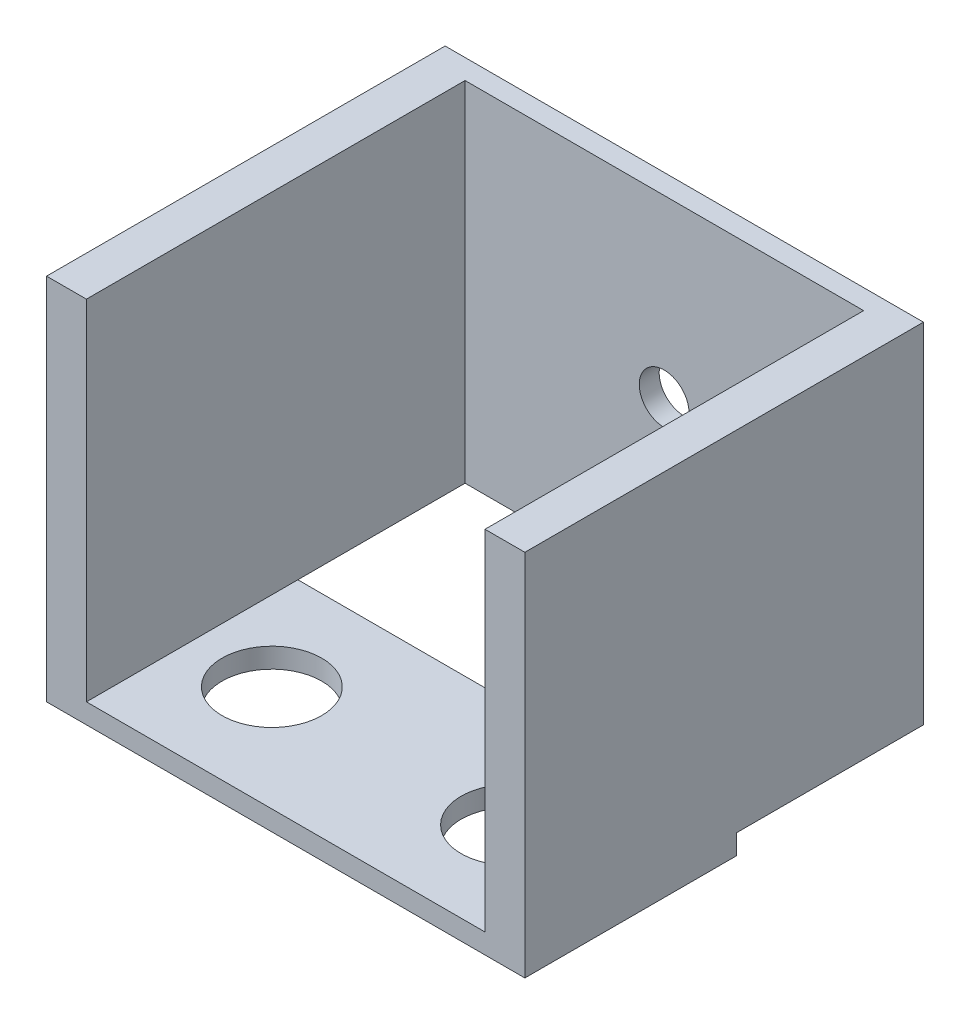
ISO-10303-21;
HEADER;
FILE_DESCRIPTION(('STEP AP214'),'2;1');
FILE_NAME('part.step','',(''),(''),'','','');
FILE_SCHEMA(('AUTOMOTIVE_DESIGN { 1 0 10303 214 1 1 1 1 }'));
ENDSEC;
DATA;
#1=APPLICATION_CONTEXT('core data for automotive mechanical design processes');
#2=APPLICATION_PROTOCOL_DEFINITION('international standard','automotive_design',2000,#1);
#3=PRODUCT_CONTEXT('',#1,'mechanical');
#4=PRODUCT('Part','Part','',(#3));
#5=PRODUCT_RELATED_PRODUCT_CATEGORY('part','',(#4));
#6=PRODUCT_DEFINITION_FORMATION('','',#4);
#7=PRODUCT_DEFINITION_CONTEXT('part definition',#1,'design');
#8=PRODUCT_DEFINITION('design','',#6,#7);
#9=PRODUCT_DEFINITION_SHAPE('','',#8);
#10=(LENGTH_UNIT() NAMED_UNIT(*) SI_UNIT(.MILLI.,.METRE.));
#11=(NAMED_UNIT(*) PLANE_ANGLE_UNIT() SI_UNIT($,.RADIAN.));
#12=(NAMED_UNIT(*) SI_UNIT($,.STERADIAN.) SOLID_ANGLE_UNIT());
#13=UNCERTAINTY_MEASURE_WITH_UNIT(LENGTH_MEASURE(1.E-05),#10,'distance_accuracy_value','');
#14=(GEOMETRIC_REPRESENTATION_CONTEXT(3) GLOBAL_UNCERTAINTY_ASSIGNED_CONTEXT((#13)) GLOBAL_UNIT_ASSIGNED_CONTEXT((#10,
#11,#12)) REPRESENTATION_CONTEXT('',''));
#15=CARTESIAN_POINT('',(0.,0.,0.));
#16=DIRECTION('',(0.,0.,1.));
#17=DIRECTION('',(1.,0.,0.));
#18=AXIS2_PLACEMENT_3D('',#15,#16,#17);
#19=CARTESIAN_POINT('',(-51.7921740237691,-38.6713921901528,2.));
#20=DIRECTION('',(0.,1.,0.));
#21=DIRECTION('',(0.,0.,1.));
#22=AXIS2_PLACEMENT_3D('',#19,#20,#21);
#23=PLANE('',#22);
#24=DIRECTION('',(1.,0.,0.));
#25=VECTOR('',#24,1.);
#26=CARTESIAN_POINT('',(-51.7921740237691,-38.6713921901528,18.7799117510892));
#27=LINE('',#26,#25);
#28=CARTESIAN_POINT('',(-51.7921740237691,-38.6713921901528,18.7799117510892));
#29=VERTEX_POINT('',#28);
#30=CARTESIAN_POINT('',(-47.7921740237691,-38.6713921901528,18.7799117510892));
#31=VERTEX_POINT('',#30);
#32=EDGE_CURVE('E50',#29,#31,#27,.T.);
#33=ORIENTED_EDGE('',*,*,#32,.F.);
#34=DIRECTION('',(0.,0.,-1.));
#35=VECTOR('',#34,1.);
#36=CARTESIAN_POINT('',(-51.7921740237691,-38.6713921901528,2.));
#37=LINE('',#36,#35);
#38=CARTESIAN_POINT('',(-51.7921740237691,-38.6713921901528,0.));
#39=VERTEX_POINT('',#38);
#40=EDGE_CURVE('E42',#29,#39,#37,.T.);
#41=ORIENTED_EDGE('',*,*,#40,.T.);
#42=DIRECTION('',(1.,0.,0.));
#43=VECTOR('',#42,1.);
#44=CARTESIAN_POINT('',(-51.7921740237691,-38.6713921901528,0.));
#45=LINE('',#44,#43);
#46=CARTESIAN_POINT('',(-3.79217402376909,-38.6713921901528,0.));
#47=VERTEX_POINT('',#46);
#48=EDGE_CURVE('E208',#39,#47,#45,.T.);
#49=ORIENTED_EDGE('',*,*,#48,.T.);
#50=DIRECTION('',(0.,0.,-1.));
#51=VECTOR('',#50,1.);
#52=CARTESIAN_POINT('',(-3.79217402376909,-38.6713921901528,2.));
#53=LINE('',#52,#51);
#54=CARTESIAN_POINT('',(-3.7921740237691,-38.6713921901528,18.7799117510892));
#55=VERTEX_POINT('',#54);
#56=EDGE_CURVE('E193',#55,#47,#53,.T.);
#57=ORIENTED_EDGE('',*,*,#56,.F.);
#58=CARTESIAN_POINT('',(-7.79217402376909,-38.6713921901528,18.7799117510892));
#59=VERTEX_POINT('',#58);
#60=EDGE_CURVE('E11',#59,#55,#27,.T.);
#61=ORIENTED_EDGE('',*,*,#60,.F.);
#62=DIRECTION('',(0.,0.,-1.));
#63=VECTOR('',#62,1.);
#64=CARTESIAN_POINT('',(-7.79217402376909,-38.6713921901528,40.));
#65=LINE('',#64,#63);
#66=CARTESIAN_POINT('',(-7.79217402376909,-38.6713921901528,2.));
#67=VERTEX_POINT('',#66);
#68=EDGE_CURVE('E236',#59,#67,#65,.T.);
#69=ORIENTED_EDGE('',*,*,#68,.T.);
#70=DIRECTION('',(1.,0.,0.));
#71=VECTOR('',#70,1.);
#72=CARTESIAN_POINT('',(-51.7921740237691,-38.6713921901528,2.));
#73=LINE('',#72,#71);
#74=CARTESIAN_POINT('',(-47.7921740237691,-38.6713921901528,2.));
#75=VERTEX_POINT('',#74);
#76=EDGE_CURVE('E174',#75,#67,#73,.T.);
#77=ORIENTED_EDGE('',*,*,#76,.F.);
#78=DIRECTION('',(0.,0.,-1.));
#79=VECTOR('',#78,1.);
#80=CARTESIAN_POINT('',(-47.7921740237691,-38.6713921901528,40.));
#81=LINE('',#80,#79);
#82=EDGE_CURVE('E179',#31,#75,#81,.T.);
#83=ORIENTED_EDGE('',*,*,#82,.F.);
#84=EDGE_LOOP('',(#33,#41,#49,#57,#61,#69,#77,#83));
#85=FACE_BOUND('',#84,.T.);
#86=ADVANCED_FACE('F33',(#85),#23,.F.);
#87=CARTESIAN_POINT('',(0.,0.,2.));
#88=DIRECTION('',(0.,0.,1.));
#89=DIRECTION('',(1.,0.,0.));
#90=AXIS2_PLACEMENT_3D('',#87,#88,#89);
#91=PLANE('',#90);
#92=CARTESIAN_POINT('',(-27.8109499656491,-21.3376292562887,2.));
#93=DIRECTION('',(0.,0.,1.));
#94=DIRECTION('',(1.,0.,0.));
#95=AXIS2_PLACEMENT_3D('',#92,#93,#94);
#96=CIRCLE('',#95,2.5);
#97=CARTESIAN_POINT('',(-25.3109499656491,-21.3376292562887,2.));
#98=VERTEX_POINT('',#97);
#99=EDGE_CURVE('E170',#98,#98,#96,.T.);
#100=ORIENTED_EDGE('',*,*,#99,.F.);
#101=EDGE_LOOP('',(#100));
#102=FACE_BOUND('',#101,.T.);
#103=ORIENTED_EDGE('',*,*,#76,.T.);
#104=DIRECTION('',(0.,-1.,0.));
#105=VECTOR('',#104,1.);
#106=CARTESIAN_POINT('',(-7.79217402376909,-3.67139219015279,2.));
#107=LINE('',#106,#105);
#108=CARTESIAN_POINT('',(-7.79217402376909,-3.67139219015279,2.));
#109=VERTEX_POINT('',#108);
#110=EDGE_CURVE('E140',#109,#67,#107,.T.);
#111=ORIENTED_EDGE('',*,*,#110,.F.);
#112=DIRECTION('',(-1.,0.,0.));
#113=VECTOR('',#112,1.);
#114=CARTESIAN_POINT('',(-51.7921740237691,-3.67139219015279,2.));
#115=LINE('',#114,#113);
#116=CARTESIAN_POINT('',(-47.7921740237691,-3.67139219015279,2.));
#117=VERTEX_POINT('',#116);
#118=EDGE_CURVE('E187',#109,#117,#115,.T.);
#119=ORIENTED_EDGE('',*,*,#118,.T.);
#120=DIRECTION('',(0.,1.,0.));
#121=VECTOR('',#120,1.);
#122=CARTESIAN_POINT('',(-47.7921740237691,-3.67139219015279,2.));
#123=LINE('',#122,#121);
#124=EDGE_CURVE('E160',#75,#117,#123,.T.);
#125=ORIENTED_EDGE('',*,*,#124,.F.);
#126=EDGE_LOOP('',(#103,#111,#119,#125));
#127=FACE_BOUND('',#126,.T.);
#128=ADVANCED_FACE('F223',(#102,#127),#91,.T.);
#129=CARTESIAN_POINT('',(0.,0.,0.));
#130=DIRECTION('',(0.,0.,1.));
#131=DIRECTION('',(1.,0.,0.));
#132=AXIS2_PLACEMENT_3D('',#129,#130,#131);
#133=PLANE('',#132);
#134=DIRECTION('',(0.,-1.,0.));
#135=VECTOR('',#134,1.);
#136=CARTESIAN_POINT('',(-51.7921740237691,-3.67139219015279,0.));
#137=LINE('',#136,#135);
#138=CARTESIAN_POINT('',(-51.7921740237691,-3.67139219015279,0.));
#139=VERTEX_POINT('',#138);
#140=EDGE_CURVE('E211',#139,#39,#137,.T.);
#141=ORIENTED_EDGE('',*,*,#140,.F.);
#142=DIRECTION('',(-1.,0.,0.));
#143=VECTOR('',#142,1.);
#144=CARTESIAN_POINT('',(-51.7921740237691,-3.67139219015279,0.));
#145=LINE('',#144,#143);
#146=CARTESIAN_POINT('',(-3.7921740237691,-3.67139219015279,0.));
#147=VERTEX_POINT('',#146);
#148=EDGE_CURVE('E204',#147,#139,#145,.T.);
#149=ORIENTED_EDGE('',*,*,#148,.F.);
#150=DIRECTION('',(0.,1.,0.));
#151=VECTOR('',#150,1.);
#152=CARTESIAN_POINT('',(-3.7921740237691,-3.67139219015279,0.));
#153=LINE('',#152,#151);
#154=EDGE_CURVE('E206',#47,#147,#153,.T.);
#155=ORIENTED_EDGE('',*,*,#154,.F.);
#156=ORIENTED_EDGE('',*,*,#48,.F.);
#157=EDGE_LOOP('',(#141,#149,#155,#156));
#158=FACE_BOUND('',#157,.T.);
#159=CARTESIAN_POINT('',(-27.8109499656491,-21.3376292562887,0.));
#160=DIRECTION('',(0.,0.,1.));
#161=DIRECTION('',(1.,0.,0.));
#162=AXIS2_PLACEMENT_3D('',#159,#160,#161);
#163=CIRCLE('',#162,2.5);
#164=CARTESIAN_POINT('',(-25.3109499656491,-21.3376292562887,0.));
#165=VERTEX_POINT('',#164);
#166=EDGE_CURVE('E184',#165,#165,#163,.T.);
#167=ORIENTED_EDGE('',*,*,#166,.T.);
#168=EDGE_LOOP('',(#167));
#169=FACE_BOUND('',#168,.T.);
#170=ADVANCED_FACE('F226',(#158,#169),#133,.F.);
#171=CARTESIAN_POINT('',(-51.7921740237691,-3.67139219015279,2.));
#172=DIRECTION('',(1.,0.,0.));
#173=DIRECTION('',(0.,0.,-1.));
#174=AXIS2_PLACEMENT_3D('',#171,#172,#173);
#175=PLANE('',#174);
#176=ORIENTED_EDGE('',*,*,#140,.T.);
#177=ORIENTED_EDGE('',*,*,#40,.F.);
#178=DIRECTION('',(0.,1.,0.));
#179=VECTOR('',#178,1.);
#180=CARTESIAN_POINT('',(-51.7921740237691,-40.6713921901528,18.7799117510892));
#181=LINE('',#180,#179);
#182=CARTESIAN_POINT('',(-51.7921740237691,-40.6713921901528,18.7799117510892));
#183=VERTEX_POINT('',#182);
#184=EDGE_CURVE('E120',#183,#29,#181,.T.);
#185=ORIENTED_EDGE('',*,*,#184,.F.);
#186=DIRECTION('',(0.,0.,-1.));
#187=VECTOR('',#186,1.);
#188=CARTESIAN_POINT('',(-51.7921740237691,-40.6713921901528,40.));
#189=LINE('',#188,#187);
#190=CARTESIAN_POINT('',(-51.7921740237691,-40.6713921901528,40.));
#191=VERTEX_POINT('',#190);
#192=EDGE_CURVE('E127',#191,#183,#189,.T.);
#193=ORIENTED_EDGE('',*,*,#192,.F.);
#194=DIRECTION('',(0.,-1.,0.));
#195=VECTOR('',#194,1.);
#196=CARTESIAN_POINT('',(-51.7921740237691,-3.67139219015279,40.));
#197=LINE('',#196,#195);
#198=CARTESIAN_POINT('',(-51.7921740237691,-3.67139219015279,40.));
#199=VERTEX_POINT('',#198);
#200=EDGE_CURVE('E153',#199,#191,#197,.T.);
#201=ORIENTED_EDGE('',*,*,#200,.F.);
#202=DIRECTION('',(0.,0.,-1.));
#203=VECTOR('',#202,1.);
#204=CARTESIAN_POINT('',(-51.7921740237691,-3.67139219015279,2.));
#205=LINE('',#204,#203);
#206=EDGE_CURVE('E201',#199,#139,#205,.T.);
#207=ORIENTED_EDGE('',*,*,#206,.T.);
#208=EDGE_LOOP('',(#176,#177,#185,#193,#201,#207));
#209=FACE_BOUND('',#208,.T.);
#210=ADVANCED_FACE('F35',(#209),#175,.F.);
#211=CARTESIAN_POINT('',(-3.7921740237691,-3.67139219015279,2.));
#212=DIRECTION('',(-1.,0.,0.));
#213=DIRECTION('',(0.,-1.,0.));
#214=AXIS2_PLACEMENT_3D('',#211,#212,#213);
#215=PLANE('',#214);
#216=ORIENTED_EDGE('',*,*,#154,.T.);
#217=DIRECTION('',(0.,0.,-1.));
#218=VECTOR('',#217,1.);
#219=CARTESIAN_POINT('',(-3.7921740237691,-3.67139219015279,2.));
#220=LINE('',#219,#218);
#221=CARTESIAN_POINT('',(-3.7921740237691,-3.67139219015279,40.));
#222=VERTEX_POINT('',#221);
#223=EDGE_CURVE('E198',#222,#147,#220,.T.);
#224=ORIENTED_EDGE('',*,*,#223,.F.);
#225=DIRECTION('',(0.,1.,0.));
#226=VECTOR('',#225,1.);
#227=CARTESIAN_POINT('',(-3.7921740237691,-3.67139219015279,40.));
#228=LINE('',#227,#226);
#229=CARTESIAN_POINT('',(-3.7921740237691,-40.6713921901528,40.));
#230=VERTEX_POINT('',#229);
#231=EDGE_CURVE('E143',#230,#222,#228,.T.);
#232=ORIENTED_EDGE('',*,*,#231,.F.);
#233=DIRECTION('',(0.,0.,1.));
#234=VECTOR('',#233,1.);
#235=CARTESIAN_POINT('',(-3.7921740237691,-40.6713921901528,40.));
#236=LINE('',#235,#234);
#237=CARTESIAN_POINT('',(-3.7921740237691,-40.6713921901528,18.7799117510892));
#238=VERTEX_POINT('',#237);
#239=EDGE_CURVE('E126',#238,#230,#236,.T.);
#240=ORIENTED_EDGE('',*,*,#239,.F.);
#241=DIRECTION('',(0.,1.,0.));
#242=VECTOR('',#241,1.);
#243=CARTESIAN_POINT('',(-3.7921740237691,-40.6713921901528,18.7799117510892));
#244=LINE('',#243,#242);
#245=EDGE_CURVE('E122',#238,#55,#244,.T.);
#246=ORIENTED_EDGE('',*,*,#245,.T.);
#247=ORIENTED_EDGE('',*,*,#56,.T.);
#248=EDGE_LOOP('',(#216,#224,#232,#240,#246,#247));
#249=FACE_BOUND('',#248,.T.);
#250=ADVANCED_FACE('F298',(#249),#215,.F.);
#251=CARTESIAN_POINT('',(-51.7921740237691,-3.67139219015279,2.));
#252=DIRECTION('',(0.,-1.,0.));
#253=DIRECTION('',(0.,0.,-1.));
#254=AXIS2_PLACEMENT_3D('',#251,#252,#253);
#255=PLANE('',#254);
#256=ORIENTED_EDGE('',*,*,#148,.T.);
#257=ORIENTED_EDGE('',*,*,#206,.F.);
#258=DIRECTION('',(-1.,0.,0.));
#259=VECTOR('',#258,1.);
#260=CARTESIAN_POINT('',(-51.7921740237691,-3.67139219015279,40.));
#261=LINE('',#260,#259);
#262=CARTESIAN_POINT('',(-47.7921740237691,-3.67139219015279,40.));
#263=VERTEX_POINT('',#262);
#264=EDGE_CURVE('E152',#263,#199,#261,.T.);
#265=ORIENTED_EDGE('',*,*,#264,.F.);
#266=DIRECTION('',(0.,0.,-1.));
#267=VECTOR('',#266,1.);
#268=CARTESIAN_POINT('',(-47.7921740237691,-3.67139219015279,40.));
#269=LINE('',#268,#267);
#270=EDGE_CURVE('E158',#263,#117,#269,.T.);
#271=ORIENTED_EDGE('',*,*,#270,.T.);
#272=ORIENTED_EDGE('',*,*,#118,.F.);
#273=DIRECTION('',(0.,0.,-1.));
#274=VECTOR('',#273,1.);
#275=CARTESIAN_POINT('',(-7.79217402376909,-3.67139219015279,40.));
#276=LINE('',#275,#274);
#277=CARTESIAN_POINT('',(-7.79217402376909,-3.67139219015279,40.));
#278=VERTEX_POINT('',#277);
#279=EDGE_CURVE('E163',#278,#109,#276,.T.);
#280=ORIENTED_EDGE('',*,*,#279,.F.);
#281=DIRECTION('',(-1.,0.,0.));
#282=VECTOR('',#281,1.);
#283=CARTESIAN_POINT('',(-3.7921740237691,-3.67139219015279,40.));
#284=LINE('',#283,#282);
#285=EDGE_CURVE('E253',#222,#278,#284,.T.);
#286=ORIENTED_EDGE('',*,*,#285,.F.);
#287=ORIENTED_EDGE('',*,*,#223,.T.);
#288=EDGE_LOOP('',(#256,#257,#265,#271,#272,#280,#286,#287));
#289=FACE_BOUND('',#288,.T.);
#290=ADVANCED_FACE('F301',(#289),#255,.F.);
#291=CARTESIAN_POINT('',(-27.8109499656491,-21.3376292562887,2.));
#292=DIRECTION('',(0.,0.,-1.));
#293=DIRECTION('',(-1.,0.,0.));
#294=AXIS2_PLACEMENT_3D('',#291,#292,#293);
#295=CYLINDRICAL_SURFACE('',#294,2.5);
#296=ORIENTED_EDGE('',*,*,#99,.T.);
#297=EDGE_LOOP('',(#296));
#298=FACE_BOUND('',#297,.T.);
#299=ORIENTED_EDGE('',*,*,#166,.F.);
#300=EDGE_LOOP('',(#299));
#301=FACE_BOUND('',#300,.T.);
#302=ADVANCED_FACE('F220',(#298,#301),#295,.F.);
#303=CARTESIAN_POINT('',(-47.7921740237691,-3.67139219015279,40.));
#304=DIRECTION('',(-1.,0.,0.));
#305=DIRECTION('',(0.,-1.,0.));
#306=AXIS2_PLACEMENT_3D('',#303,#304,#305);
#307=PLANE('',#306);
#308=ORIENTED_EDGE('',*,*,#124,.T.);
#309=ORIENTED_EDGE('',*,*,#270,.F.);
#310=DIRECTION('',(0.,1.,0.));
#311=VECTOR('',#310,1.);
#312=CARTESIAN_POINT('',(-47.7921740237691,-3.67139219015279,40.));
#313=LINE('',#312,#311);
#314=CARTESIAN_POINT('',(-47.7921740237691,-38.6713921901528,40.));
#315=VERTEX_POINT('',#314);
#316=EDGE_CURVE('E151',#315,#263,#313,.T.);
#317=ORIENTED_EDGE('',*,*,#316,.F.);
#318=EDGE_CURVE('E182',#315,#31,#81,.T.);
#319=ORIENTED_EDGE('',*,*,#318,.T.);
#320=ORIENTED_EDGE('',*,*,#82,.T.);
#321=EDGE_LOOP('',(#308,#309,#317,#319,#320));
#322=FACE_BOUND('',#321,.T.);
#323=ADVANCED_FACE('F310',(#322),#307,.F.);
#324=CARTESIAN_POINT('',(0.,0.,40.));
#325=DIRECTION('',(0.,0.,1.));
#326=DIRECTION('',(1.,0.,0.));
#327=AXIS2_PLACEMENT_3D('',#324,#325,#326);
#328=PLANE('',#327);
#329=ORIENTED_EDGE('',*,*,#200,.T.);
#330=DIRECTION('',(-1.,0.,0.));
#331=VECTOR('',#330,1.);
#332=CARTESIAN_POINT('',(-51.7921740237691,-40.6713921901528,40.));
#333=LINE('',#332,#331);
#334=EDGE_CURVE('E134',#230,#191,#333,.T.);
#335=ORIENTED_EDGE('',*,*,#334,.F.);
#336=ORIENTED_EDGE('',*,*,#231,.T.);
#337=ORIENTED_EDGE('',*,*,#285,.T.);
#338=DIRECTION('',(0.,-1.,0.));
#339=VECTOR('',#338,1.);
#340=CARTESIAN_POINT('',(-7.79217402376909,-3.67139219015279,40.));
#341=LINE('',#340,#339);
#342=CARTESIAN_POINT('',(-7.79217402376909,-38.6713921901528,40.));
#343=VERTEX_POINT('',#342);
#344=EDGE_CURVE('E240',#278,#343,#341,.T.);
#345=ORIENTED_EDGE('',*,*,#344,.T.);
#346=DIRECTION('',(-1.,0.,0.));
#347=VECTOR('',#346,1.);
#348=CARTESIAN_POINT('',(-51.7921740237691,-38.6713921901528,40.));
#349=LINE('',#348,#347);
#350=EDGE_CURVE('E137',#343,#315,#349,.T.);
#351=ORIENTED_EDGE('',*,*,#350,.T.);
#352=ORIENTED_EDGE('',*,*,#316,.T.);
#353=ORIENTED_EDGE('',*,*,#264,.T.);
#354=EDGE_LOOP('',(#329,#335,#336,#337,#345,#351,#352,#353));
#355=FACE_BOUND('',#354,.T.);
#356=ADVANCED_FACE('F313',(#355),#328,.T.);
#357=CARTESIAN_POINT('',(-7.79217402376909,-3.67139219015279,40.));
#358=DIRECTION('',(1.,0.,0.));
#359=DIRECTION('',(0.,1.,0.));
#360=AXIS2_PLACEMENT_3D('',#357,#358,#359);
#361=PLANE('',#360);
#362=ORIENTED_EDGE('',*,*,#110,.T.);
#363=ORIENTED_EDGE('',*,*,#68,.F.);
#364=EDGE_CURVE('E243',#343,#59,#65,.T.);
#365=ORIENTED_EDGE('',*,*,#364,.F.);
#366=ORIENTED_EDGE('',*,*,#344,.F.);
#367=ORIENTED_EDGE('',*,*,#279,.T.);
#368=EDGE_LOOP('',(#362,#363,#365,#366,#367));
#369=FACE_BOUND('',#368,.T.);
#370=ADVANCED_FACE('F234',(#369),#361,.F.);
#371=CARTESIAN_POINT('',(0.,-38.6713921901528,0.));
#372=DIRECTION('',(0.,-1.,0.));
#373=DIRECTION('',(0.,0.,-1.));
#374=AXIS2_PLACEMENT_3D('',#371,#372,#373);
#375=PLANE('',#374);
#376=CARTESIAN_POINT('',(-39.7921740237691,-38.6713921901528,29.3899558755446));
#377=DIRECTION('',(0.,-1.,0.));
#378=DIRECTION('',(0.,0.,-1.));
#379=AXIS2_PLACEMENT_3D('',#376,#377,#378);
#380=CIRCLE('',#379,5.);
#381=CARTESIAN_POINT('',(-39.7921740237691,-38.6713921901528,24.3899558755446));
#382=VERTEX_POINT('',#381);
#383=EDGE_CURVE('E266',#382,#382,#380,.T.);
#384=ORIENTED_EDGE('',*,*,#383,.T.);
#385=EDGE_LOOP('',(#384));
#386=FACE_BOUND('',#385,.T.);
#387=CARTESIAN_POINT('',(-15.7921740237691,-38.6713921901528,29.3899558755446));
#388=DIRECTION('',(0.,-1.,0.));
#389=DIRECTION('',(0.,0.,-1.));
#390=AXIS2_PLACEMENT_3D('',#387,#388,#389);
#391=CIRCLE('',#390,5.);
#392=CARTESIAN_POINT('',(-15.7921740237691,-38.6713921901528,24.3899558755446));
#393=VERTEX_POINT('',#392);
#394=EDGE_CURVE('E272',#393,#393,#391,.T.);
#395=ORIENTED_EDGE('',*,*,#394,.T.);
#396=EDGE_LOOP('',(#395));
#397=FACE_BOUND('',#396,.T.);
#398=ORIENTED_EDGE('',*,*,#350,.F.);
#399=ORIENTED_EDGE('',*,*,#364,.T.);
#400=EDGE_CURVE('E259',#31,#59,#27,.T.);
#401=ORIENTED_EDGE('',*,*,#400,.F.);
#402=ORIENTED_EDGE('',*,*,#318,.F.);
#403=EDGE_LOOP('',(#398,#399,#401,#402));
#404=FACE_BOUND('',#403,.T.);
#405=ADVANCED_FACE('F281',(#386,#397,#404),#375,.F.);
#406=CARTESIAN_POINT('',(0.,-40.6713921901528,0.));
#407=DIRECTION('',(0.,-1.,0.));
#408=DIRECTION('',(0.,0.,-1.));
#409=AXIS2_PLACEMENT_3D('',#406,#407,#408);
#410=PLANE('',#409);
#411=CARTESIAN_POINT('',(-39.7921740237691,-40.6713921901528,29.3899558755446));
#412=DIRECTION('',(0.,-1.,0.));
#413=DIRECTION('',(0.,0.,-1.));
#414=AXIS2_PLACEMENT_3D('',#411,#412,#413);
#415=CIRCLE('',#414,5.);
#416=CARTESIAN_POINT('',(-39.7921740237691,-40.6713921901528,24.3899558755446));
#417=VERTEX_POINT('',#416);
#418=EDGE_CURVE('E262',#417,#417,#415,.T.);
#419=ORIENTED_EDGE('',*,*,#418,.F.);
#420=EDGE_LOOP('',(#419));
#421=FACE_BOUND('',#420,.T.);
#422=ORIENTED_EDGE('',*,*,#192,.T.);
#423=DIRECTION('',(1.,0.,0.));
#424=VECTOR('',#423,1.);
#425=CARTESIAN_POINT('',(-51.7921740237691,-40.6713921901528,18.7799117510892));
#426=LINE('',#425,#424);
#427=EDGE_CURVE('E116',#183,#238,#426,.T.);
#428=ORIENTED_EDGE('',*,*,#427,.T.);
#429=ORIENTED_EDGE('',*,*,#239,.T.);
#430=ORIENTED_EDGE('',*,*,#334,.T.);
#431=EDGE_LOOP('',(#422,#428,#429,#430));
#432=FACE_BOUND('',#431,.T.);
#433=CARTESIAN_POINT('',(-15.7921740237691,-40.6713921901528,29.3899558755446));
#434=DIRECTION('',(0.,-1.,0.));
#435=DIRECTION('',(0.,0.,-1.));
#436=AXIS2_PLACEMENT_3D('',#433,#434,#435);
#437=CIRCLE('',#436,5.);
#438=CARTESIAN_POINT('',(-15.7921740237691,-40.6713921901528,24.3899558755446));
#439=VERTEX_POINT('',#438);
#440=EDGE_CURVE('E269',#439,#439,#437,.T.);
#441=ORIENTED_EDGE('',*,*,#440,.F.);
#442=EDGE_LOOP('',(#441));
#443=FACE_BOUND('',#442,.T.);
#444=ADVANCED_FACE('F131',(#421,#432,#443),#410,.T.);
#445=CARTESIAN_POINT('',(-51.7921740237691,-40.6713921901528,18.7799117510892));
#446=DIRECTION('',(0.,0.,1.));
#447=DIRECTION('',(1.,0.,0.));
#448=AXIS2_PLACEMENT_3D('',#445,#446,#447);
#449=PLANE('',#448);
#450=ORIENTED_EDGE('',*,*,#32,.T.);
#451=ORIENTED_EDGE('',*,*,#400,.T.);
#452=ORIENTED_EDGE('',*,*,#60,.T.);
#453=ORIENTED_EDGE('',*,*,#245,.F.);
#454=ORIENTED_EDGE('',*,*,#427,.F.);
#455=ORIENTED_EDGE('',*,*,#184,.T.);
#456=EDGE_LOOP('',(#450,#451,#452,#453,#454,#455));
#457=FACE_BOUND('',#456,.T.);
#458=ADVANCED_FACE('F118',(#457),#449,.F.);
#459=CARTESIAN_POINT('',(-39.7921740237691,-40.6713921901528,29.3899558755446));
#460=DIRECTION('',(0.,1.,0.));
#461=DIRECTION('',(0.,0.,1.));
#462=AXIS2_PLACEMENT_3D('',#459,#460,#461);
#463=CYLINDRICAL_SURFACE('',#462,5.);
#464=ORIENTED_EDGE('',*,*,#418,.T.);
#465=EDGE_LOOP('',(#464));
#466=FACE_BOUND('',#465,.T.);
#467=ORIENTED_EDGE('',*,*,#383,.F.);
#468=EDGE_LOOP('',(#467));
#469=FACE_BOUND('',#468,.T.);
#470=ADVANCED_FACE('F288',(#466,#469),#463,.F.);
#471=CARTESIAN_POINT('',(-15.7921740237691,-40.6713921901528,29.3899558755446));
#472=DIRECTION('',(0.,1.,0.));
#473=DIRECTION('',(0.,0.,1.));
#474=AXIS2_PLACEMENT_3D('',#471,#472,#473);
#475=CYLINDRICAL_SURFACE('',#474,5.);
#476=ORIENTED_EDGE('',*,*,#440,.T.);
#477=EDGE_LOOP('',(#476));
#478=FACE_BOUND('',#477,.T.);
#479=ORIENTED_EDGE('',*,*,#394,.F.);
#480=EDGE_LOOP('',(#479));
#481=FACE_BOUND('',#480,.T.);
#482=ADVANCED_FACE('F278',(#478,#481),#475,.F.);
#483=CLOSED_SHELL('',(#86,#128,#170,#210,#250,#290,#302,#323,#356,#370,#405,#444,#458,#470,#482));
#484=MANIFOLD_SOLID_BREP('B2',#483);
#485=ADVANCED_BREP_SHAPE_REPRESENTATION('',(#18,#484),#14);
#486=SHAPE_DEFINITION_REPRESENTATION(#9,#485);
ENDSEC;
END-ISO-10303-21;
